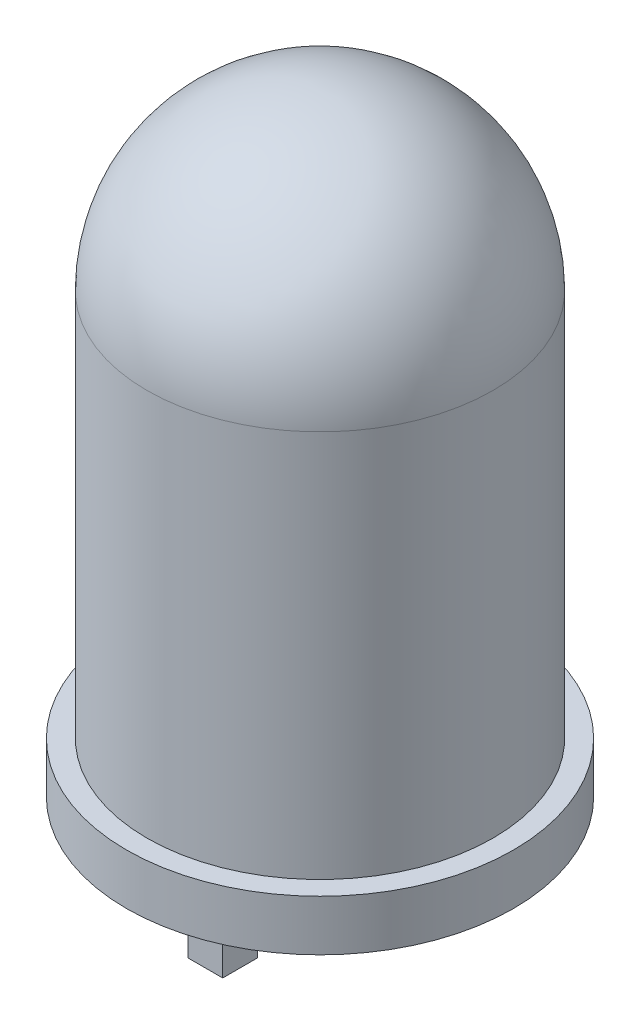
ISO-10303-21;
HEADER;
FILE_DESCRIPTION(('STEP AP214'),'2;1');
FILE_NAME('part.step','',(''),(''),'','','');
FILE_SCHEMA(('AUTOMOTIVE_DESIGN { 1 0 10303 214 1 1 1 1 }'));
ENDSEC;
DATA;
#1=APPLICATION_CONTEXT('core data for automotive mechanical design processes');
#2=APPLICATION_PROTOCOL_DEFINITION('international standard','automotive_design',2000,#1);
#3=PRODUCT_CONTEXT('',#1,'mechanical');
#4=PRODUCT('Part','Part','',(#3));
#5=PRODUCT_RELATED_PRODUCT_CATEGORY('part','',(#4));
#6=PRODUCT_DEFINITION_FORMATION('','',#4);
#7=PRODUCT_DEFINITION_CONTEXT('part definition',#1,'design');
#8=PRODUCT_DEFINITION('design','',#6,#7);
#9=PRODUCT_DEFINITION_SHAPE('','',#8);
#10=(LENGTH_UNIT() NAMED_UNIT(*) SI_UNIT(.MILLI.,.METRE.));
#11=(NAMED_UNIT(*) PLANE_ANGLE_UNIT() SI_UNIT($,.RADIAN.));
#12=(NAMED_UNIT(*) SI_UNIT($,.STERADIAN.) SOLID_ANGLE_UNIT());
#13=UNCERTAINTY_MEASURE_WITH_UNIT(LENGTH_MEASURE(1.E-05),#10,'distance_accuracy_value','');
#14=(GEOMETRIC_REPRESENTATION_CONTEXT(3) GLOBAL_UNCERTAINTY_ASSIGNED_CONTEXT((#13)) GLOBAL_UNIT_ASSIGNED_CONTEXT((#10,
#11,#12)) REPRESENTATION_CONTEXT('',''));
#15=CARTESIAN_POINT('',(0.,0.,0.));
#16=DIRECTION('',(0.,0.,1.));
#17=DIRECTION('',(1.,0.,0.));
#18=AXIS2_PLACEMENT_3D('',#15,#16,#17);
#19=CARTESIAN_POINT('',(2.785,-4.4,0.));
#20=DIRECTION('',(0.,-1.,0.));
#21=DIRECTION('',(0.,0.,-1.));
#22=AXIS2_PLACEMENT_3D('',#19,#20,#21);
#23=PLANE('',#22);
#24=CARTESIAN_POINT('',(0.,-4.4,0.));
#25=DIRECTION('',(0.,-1.,0.));
#26=DIRECTION('',(0.,0.,-1.));
#27=AXIS2_PLACEMENT_3D('',#24,#25,#26);
#28=CIRCLE('',#27,2.785);
#29=CARTESIAN_POINT('',(0.,-4.4,-2.785));
#30=VERTEX_POINT('',#29);
#31=EDGE_CURVE('E175',#30,#30,#28,.T.);
#32=ORIENTED_EDGE('',*,*,#31,.T.);
#33=EDGE_LOOP('',(#32));
#34=FACE_BOUND('',#33,.T.);
#35=DIRECTION('',(-1.,0.,0.));
#36=VECTOR('',#35,1.);
#37=CARTESIAN_POINT('',(0.25,-4.4,-1.15));
#38=LINE('',#37,#36);
#39=CARTESIAN_POINT('',(0.25,-4.4,-1.15));
#40=VERTEX_POINT('',#39);
#41=CARTESIAN_POINT('',(-0.25,-4.4,-1.15));
#42=VERTEX_POINT('',#41);
#43=EDGE_CURVE('E153',#40,#42,#38,.T.);
#44=ORIENTED_EDGE('',*,*,#43,.F.);
#45=DIRECTION('',(0.,0.,1.));
#46=VECTOR('',#45,1.);
#47=CARTESIAN_POINT('',(0.25,-4.4,-1.65));
#48=LINE('',#47,#46);
#49=CARTESIAN_POINT('',(0.25,-4.4,-1.65));
#50=VERTEX_POINT('',#49);
#51=EDGE_CURVE('E134',#50,#40,#48,.T.);
#52=ORIENTED_EDGE('',*,*,#51,.F.);
#53=DIRECTION('',(1.,0.,0.));
#54=VECTOR('',#53,1.);
#55=CARTESIAN_POINT('',(0.25,-4.4,-1.65));
#56=LINE('',#55,#54);
#57=CARTESIAN_POINT('',(-0.25,-4.4,-1.65));
#58=VERTEX_POINT('',#57);
#59=EDGE_CURVE('E140',#58,#50,#56,.T.);
#60=ORIENTED_EDGE('',*,*,#59,.F.);
#61=DIRECTION('',(0.,0.,-1.));
#62=VECTOR('',#61,1.);
#63=CARTESIAN_POINT('',(-0.25,-4.4,-1.65));
#64=LINE('',#63,#62);
#65=EDGE_CURVE('E156',#42,#58,#64,.T.);
#66=ORIENTED_EDGE('',*,*,#65,.F.);
#67=EDGE_LOOP('',(#44,#52,#60,#66));
#68=FACE_BOUND('',#67,.T.);
#69=DIRECTION('',(-1.,0.,0.));
#70=VECTOR('',#69,1.);
#71=CARTESIAN_POINT('',(0.25,-4.4,1.65));
#72=LINE('',#71,#70);
#73=CARTESIAN_POINT('',(0.25,-4.4,1.65));
#74=VERTEX_POINT('',#73);
#75=CARTESIAN_POINT('',(-0.25,-4.4,1.65));
#76=VERTEX_POINT('',#75);
#77=EDGE_CURVE('E337',#74,#76,#72,.T.);
#78=ORIENTED_EDGE('',*,*,#77,.F.);
#79=DIRECTION('',(0.,0.,1.));
#80=VECTOR('',#79,1.);
#81=CARTESIAN_POINT('',(0.25,-4.4,1.15));
#82=LINE('',#81,#80);
#83=CARTESIAN_POINT('',(0.25,-4.4,1.15));
#84=VERTEX_POINT('',#83);
#85=EDGE_CURVE('E113',#84,#74,#82,.T.);
#86=ORIENTED_EDGE('',*,*,#85,.F.);
#87=DIRECTION('',(1.,0.,0.));
#88=VECTOR('',#87,1.);
#89=CARTESIAN_POINT('',(0.25,-4.4,1.15));
#90=LINE('',#89,#88);
#91=CARTESIAN_POINT('',(-0.25,-4.4,1.15));
#92=VERTEX_POINT('',#91);
#93=EDGE_CURVE('E118',#92,#84,#90,.T.);
#94=ORIENTED_EDGE('',*,*,#93,.F.);
#95=DIRECTION('',(0.,0.,-1.));
#96=VECTOR('',#95,1.);
#97=CARTESIAN_POINT('',(-0.25,-4.4,1.15));
#98=LINE('',#97,#96);
#99=EDGE_CURVE('E126',#76,#92,#98,.T.);
#100=ORIENTED_EDGE('',*,*,#99,.F.);
#101=EDGE_LOOP('',(#78,#86,#94,#100));
#102=FACE_BOUND('',#101,.T.);
#103=ADVANCED_FACE('F39',(#34,#68,#102),#23,.T.);
#104=CARTESIAN_POINT('',(0.,1.91,0.));
#105=DIRECTION('',(0.,-1.,0.));
#106=DIRECTION('',(1.,0.,0.));
#107=AXIS2_PLACEMENT_3D('',#104,#105,#106);
#108=SPHERICAL_SURFACE('',#107,2.49);
#109=CARTESIAN_POINT('',(0.,1.91,0.));
#110=DIRECTION('',(0.,-1.,0.));
#111=DIRECTION('',(0.,0.,-1.));
#112=AXIS2_PLACEMENT_3D('',#109,#110,#111);
#113=CIRCLE('',#112,2.49);
#114=CARTESIAN_POINT('',(0.,1.91,-2.49));
#115=VERTEX_POINT('',#114);
#116=EDGE_CURVE('E47',#115,#115,#113,.T.);
#117=ORIENTED_EDGE('',*,*,#116,.F.);
#118=EDGE_LOOP('',(#117));
#119=FACE_BOUND('',#118,.T.);
#120=ADVANCED_FACE('F193',(#119),#108,.T.);
#121=CARTESIAN_POINT('',(0.,-4.4,0.));
#122=DIRECTION('',(0.,-1.,0.));
#123=DIRECTION('',(0.,0.,-1.));
#124=AXIS2_PLACEMENT_3D('',#121,#122,#123);
#125=CYLINDRICAL_SURFACE('',#124,2.49);
#126=ORIENTED_EDGE('',*,*,#116,.T.);
#127=EDGE_LOOP('',(#126));
#128=FACE_BOUND('',#127,.T.);
#129=CARTESIAN_POINT('',(0.,-3.66986899563319,0.));
#130=DIRECTION('',(0.,-1.,0.));
#131=DIRECTION('',(0.,0.,-1.));
#132=AXIS2_PLACEMENT_3D('',#129,#130,#131);
#133=CIRCLE('',#132,2.49);
#134=CARTESIAN_POINT('',(0.,-3.66986899563319,-2.49));
#135=VERTEX_POINT('',#134);
#136=EDGE_CURVE('E183',#135,#135,#133,.T.);
#137=ORIENTED_EDGE('',*,*,#136,.F.);
#138=EDGE_LOOP('',(#137));
#139=FACE_BOUND('',#138,.T.);
#140=ADVANCED_FACE('F190',(#128,#139),#125,.T.);
#141=CARTESIAN_POINT('',(2.49,-3.66986899563319,0.));
#142=DIRECTION('',(0.,1.,0.));
#143=DIRECTION('',(0.,0.,1.));
#144=AXIS2_PLACEMENT_3D('',#141,#142,#143);
#145=PLANE('',#144);
#146=ORIENTED_EDGE('',*,*,#136,.T.);
#147=EDGE_LOOP('',(#146));
#148=FACE_BOUND('',#147,.T.);
#149=CARTESIAN_POINT('',(0.,-3.66986899563319,0.));
#150=DIRECTION('',(0.,-1.,0.));
#151=DIRECTION('',(0.,0.,-1.));
#152=AXIS2_PLACEMENT_3D('',#149,#150,#151);
#153=CIRCLE('',#152,2.785);
#154=CARTESIAN_POINT('',(0.,-3.66986899563319,-2.785));
#155=VERTEX_POINT('',#154);
#156=EDGE_CURVE('E179',#155,#155,#153,.T.);
#157=ORIENTED_EDGE('',*,*,#156,.F.);
#158=EDGE_LOOP('',(#157));
#159=FACE_BOUND('',#158,.T.);
#160=ADVANCED_FACE('F199',(#148,#159),#145,.T.);
#161=CARTESIAN_POINT('',(0.,-4.4,0.));
#162=DIRECTION('',(0.,-1.,0.));
#163=DIRECTION('',(0.,0.,-1.));
#164=AXIS2_PLACEMENT_3D('',#161,#162,#163);
#165=CYLINDRICAL_SURFACE('',#164,2.785);
#166=ORIENTED_EDGE('',*,*,#156,.T.);
#167=EDGE_LOOP('',(#166));
#168=FACE_BOUND('',#167,.T.);
#169=ORIENTED_EDGE('',*,*,#31,.F.);
#170=EDGE_LOOP('',(#169));
#171=FACE_BOUND('',#170,.T.);
#172=ADVANCED_FACE('F205',(#168,#171),#165,.T.);
#173=CARTESIAN_POINT('',(0.25,-6.4,-1.65));
#174=DIRECTION('',(-1.,0.,0.));
#175=DIRECTION('',(0.,0.,1.));
#176=AXIS2_PLACEMENT_3D('',#173,#174,#175);
#177=PLANE('',#176);
#178=ORIENTED_EDGE('',*,*,#51,.T.);
#179=DIRECTION('',(0.,1.,0.));
#180=VECTOR('',#179,1.);
#181=CARTESIAN_POINT('',(0.25,-6.4,-1.15));
#182=LINE('',#181,#180);
#183=CARTESIAN_POINT('',(0.25,-6.4,-1.15));
#184=VERTEX_POINT('',#183);
#185=EDGE_CURVE('E172',#184,#40,#182,.T.);
#186=ORIENTED_EDGE('',*,*,#185,.F.);
#187=DIRECTION('',(0.,0.,1.));
#188=VECTOR('',#187,1.);
#189=CARTESIAN_POINT('',(0.25,-6.4,-1.65));
#190=LINE('',#189,#188);
#191=CARTESIAN_POINT('',(0.25,-6.4,-1.65));
#192=VERTEX_POINT('',#191);
#193=EDGE_CURVE('E135',#192,#184,#190,.T.);
#194=ORIENTED_EDGE('',*,*,#193,.F.);
#195=DIRECTION('',(0.,1.,0.));
#196=VECTOR('',#195,1.);
#197=CARTESIAN_POINT('',(0.25,-6.4,-1.65));
#198=LINE('',#197,#196);
#199=EDGE_CURVE('E149',#192,#50,#198,.T.);
#200=ORIENTED_EDGE('',*,*,#199,.T.);
#201=EDGE_LOOP('',(#178,#186,#194,#200));
#202=FACE_BOUND('',#201,.T.);
#203=ADVANCED_FACE('F209',(#202),#177,.F.);
#204=CARTESIAN_POINT('',(0.25,-6.4,-1.15));
#205=DIRECTION('',(0.,0.,-1.));
#206=DIRECTION('',(-1.,0.,0.));
#207=AXIS2_PLACEMENT_3D('',#204,#205,#206);
#208=PLANE('',#207);
#209=ORIENTED_EDGE('',*,*,#43,.T.);
#210=DIRECTION('',(0.,1.,0.));
#211=VECTOR('',#210,1.);
#212=CARTESIAN_POINT('',(-0.25,-6.4,-1.15));
#213=LINE('',#212,#211);
#214=CARTESIAN_POINT('',(-0.25,-6.4,-1.15));
#215=VERTEX_POINT('',#214);
#216=EDGE_CURVE('E168',#215,#42,#213,.T.);
#217=ORIENTED_EDGE('',*,*,#216,.F.);
#218=DIRECTION('',(-1.,0.,0.));
#219=VECTOR('',#218,1.);
#220=CARTESIAN_POINT('',(0.25,-6.4,-1.15));
#221=LINE('',#220,#219);
#222=EDGE_CURVE('E139',#184,#215,#221,.T.);
#223=ORIENTED_EDGE('',*,*,#222,.F.);
#224=ORIENTED_EDGE('',*,*,#185,.T.);
#225=EDGE_LOOP('',(#209,#217,#223,#224));
#226=FACE_BOUND('',#225,.T.);
#227=ADVANCED_FACE('F213',(#226),#208,.F.);
#228=CARTESIAN_POINT('',(-0.25,-6.4,-1.65));
#229=DIRECTION('',(1.,0.,0.));
#230=DIRECTION('',(0.,0.,-1.));
#231=AXIS2_PLACEMENT_3D('',#228,#229,#230);
#232=PLANE('',#231);
#233=ORIENTED_EDGE('',*,*,#65,.T.);
#234=DIRECTION('',(0.,1.,0.));
#235=VECTOR('',#234,1.);
#236=CARTESIAN_POINT('',(-0.25,-6.4,-1.65));
#237=LINE('',#236,#235);
#238=CARTESIAN_POINT('',(-0.25,-6.4,-1.65));
#239=VERTEX_POINT('',#238);
#240=EDGE_CURVE('E165',#239,#58,#237,.T.);
#241=ORIENTED_EDGE('',*,*,#240,.F.);
#242=DIRECTION('',(0.,0.,-1.));
#243=VECTOR('',#242,1.);
#244=CARTESIAN_POINT('',(-0.25,-6.4,-1.65));
#245=LINE('',#244,#243);
#246=EDGE_CURVE('E143',#215,#239,#245,.T.);
#247=ORIENTED_EDGE('',*,*,#246,.F.);
#248=ORIENTED_EDGE('',*,*,#216,.T.);
#249=EDGE_LOOP('',(#233,#241,#247,#248));
#250=FACE_BOUND('',#249,.T.);
#251=ADVANCED_FACE('F217',(#250),#232,.F.);
#252=CARTESIAN_POINT('',(0.25,-6.4,-1.65));
#253=DIRECTION('',(0.,0.,1.));
#254=DIRECTION('',(1.,0.,0.));
#255=AXIS2_PLACEMENT_3D('',#252,#253,#254);
#256=PLANE('',#255);
#257=ORIENTED_EDGE('',*,*,#59,.T.);
#258=ORIENTED_EDGE('',*,*,#199,.F.);
#259=DIRECTION('',(1.,0.,0.));
#260=VECTOR('',#259,1.);
#261=CARTESIAN_POINT('',(0.25,-6.4,-1.65));
#262=LINE('',#261,#260);
#263=EDGE_CURVE('E146',#239,#192,#262,.T.);
#264=ORIENTED_EDGE('',*,*,#263,.F.);
#265=ORIENTED_EDGE('',*,*,#240,.T.);
#266=EDGE_LOOP('',(#257,#258,#264,#265));
#267=FACE_BOUND('',#266,.T.);
#268=ADVANCED_FACE('F221',(#267),#256,.F.);
#269=CARTESIAN_POINT('',(0.,-6.4,0.));
#270=DIRECTION('',(0.,-1.,0.));
#271=DIRECTION('',(0.,0.,-1.));
#272=AXIS2_PLACEMENT_3D('',#269,#270,#271);
#273=PLANE('',#272);
#274=ORIENTED_EDGE('',*,*,#193,.T.);
#275=ORIENTED_EDGE('',*,*,#222,.T.);
#276=ORIENTED_EDGE('',*,*,#246,.T.);
#277=ORIENTED_EDGE('',*,*,#263,.T.);
#278=EDGE_LOOP('',(#274,#275,#276,#277));
#279=FACE_BOUND('',#278,.T.);
#280=ADVANCED_FACE('F225',(#279),#273,.T.);
#281=CARTESIAN_POINT('',(0.25,-6.4,1.15));
#282=DIRECTION('',(-1.,0.,0.));
#283=DIRECTION('',(0.,0.,1.));
#284=AXIS2_PLACEMENT_3D('',#281,#282,#283);
#285=PLANE('',#284);
#286=DIRECTION('',(0.,1.,0.));
#287=VECTOR('',#286,1.);
#288=CARTESIAN_POINT('',(0.25,-6.4,1.65));
#289=LINE('',#288,#287);
#290=CARTESIAN_POINT('',(0.25,-5.70756782145611,1.65));
#291=VERTEX_POINT('',#290);
#292=EDGE_CURVE('E111',#291,#74,#289,.T.);
#293=ORIENTED_EDGE('',*,*,#292,.F.);
#294=DIRECTION('',(0.,0.,-1.));
#295=VECTOR('',#294,1.);
#296=CARTESIAN_POINT('',(0.25,-5.70756782145611,1.15));
#297=LINE('',#296,#295);
#298=CARTESIAN_POINT('',(0.25,-5.70756782145611,1.15));
#299=VERTEX_POINT('',#298);
#300=EDGE_CURVE('E103',#291,#299,#297,.T.);
#301=ORIENTED_EDGE('',*,*,#300,.T.);
#302=DIRECTION('',(0.,1.,0.));
#303=VECTOR('',#302,1.);
#304=CARTESIAN_POINT('',(0.25,-6.4,1.15));
#305=LINE('',#304,#303);
#306=EDGE_CURVE('E110',#299,#84,#305,.T.);
#307=ORIENTED_EDGE('',*,*,#306,.T.);
#308=ORIENTED_EDGE('',*,*,#85,.T.);
#309=EDGE_LOOP('',(#293,#301,#307,#308));
#310=FACE_BOUND('',#309,.T.);
#311=ADVANCED_FACE('F108',(#310),#285,.F.);
#312=CARTESIAN_POINT('',(0.25,-6.4,1.65));
#313=DIRECTION('',(0.,0.,-1.));
#314=DIRECTION('',(-1.,0.,0.));
#315=AXIS2_PLACEMENT_3D('',#312,#313,#314);
#316=PLANE('',#315);
#317=DIRECTION('',(0.,1.,0.));
#318=VECTOR('',#317,1.);
#319=CARTESIAN_POINT('',(-0.25,-6.4,1.65));
#320=LINE('',#319,#318);
#321=CARTESIAN_POINT('',(-0.25,-5.70756782145611,1.65));
#322=VERTEX_POINT('',#321);
#323=EDGE_CURVE('E124',#322,#76,#320,.T.);
#324=ORIENTED_EDGE('',*,*,#323,.F.);
#325=DIRECTION('',(1.,0.,0.));
#326=VECTOR('',#325,1.);
#327=CARTESIAN_POINT('',(0.25,-5.70756782145611,1.65));
#328=LINE('',#327,#326);
#329=EDGE_CURVE('E114',#322,#291,#328,.T.);
#330=ORIENTED_EDGE('',*,*,#329,.T.);
#331=ORIENTED_EDGE('',*,*,#292,.T.);
#332=ORIENTED_EDGE('',*,*,#77,.T.);
#333=EDGE_LOOP('',(#324,#330,#331,#332));
#334=FACE_BOUND('',#333,.T.);
#335=ADVANCED_FACE('F232',(#334),#316,.F.);
#336=CARTESIAN_POINT('',(-0.25,-6.4,1.15));
#337=DIRECTION('',(1.,0.,0.));
#338=DIRECTION('',(0.,0.,-1.));
#339=AXIS2_PLACEMENT_3D('',#336,#337,#338);
#340=PLANE('',#339);
#341=DIRECTION('',(0.,1.,0.));
#342=VECTOR('',#341,1.);
#343=CARTESIAN_POINT('',(-0.25,-6.4,1.15));
#344=LINE('',#343,#342);
#345=CARTESIAN_POINT('',(-0.25,-5.70756782145611,1.15));
#346=VERTEX_POINT('',#345);
#347=EDGE_CURVE('E60',#346,#92,#344,.T.);
#348=ORIENTED_EDGE('',*,*,#347,.F.);
#349=DIRECTION('',(0.,0.,1.));
#350=VECTOR('',#349,1.);
#351=CARTESIAN_POINT('',(-0.25,-5.70756782145611,1.15));
#352=LINE('',#351,#350);
#353=EDGE_CURVE('E54',#346,#322,#352,.T.);
#354=ORIENTED_EDGE('',*,*,#353,.T.);
#355=ORIENTED_EDGE('',*,*,#323,.T.);
#356=ORIENTED_EDGE('',*,*,#99,.T.);
#357=EDGE_LOOP('',(#348,#354,#355,#356));
#358=FACE_BOUND('',#357,.T.);
#359=ADVANCED_FACE('F235',(#358),#340,.F.);
#360=CARTESIAN_POINT('',(0.25,-6.4,1.15));
#361=DIRECTION('',(0.,0.,1.));
#362=DIRECTION('',(1.,0.,0.));
#363=AXIS2_PLACEMENT_3D('',#360,#361,#362);
#364=PLANE('',#363);
#365=ORIENTED_EDGE('',*,*,#306,.F.);
#366=DIRECTION('',(-1.,0.,0.));
#367=VECTOR('',#366,1.);
#368=CARTESIAN_POINT('',(0.25,-5.70756782145611,1.15));
#369=LINE('',#368,#367);
#370=EDGE_CURVE('E11',#299,#346,#369,.T.);
#371=ORIENTED_EDGE('',*,*,#370,.T.);
#372=ORIENTED_EDGE('',*,*,#347,.T.);
#373=ORIENTED_EDGE('',*,*,#93,.T.);
#374=EDGE_LOOP('',(#365,#371,#372,#373));
#375=FACE_BOUND('',#374,.T.);
#376=ADVANCED_FACE('F116',(#375),#364,.F.);
#377=CARTESIAN_POINT('',(-2.785,-5.70756782145611,-0.211211214483882));
#378=DIRECTION('',(0.,1.,0.));
#379=DIRECTION('',(0.,0.,1.));
#380=AXIS2_PLACEMENT_3D('',#377,#378,#379);
#381=PLANE('',#380);
#382=ORIENTED_EDGE('',*,*,#329,.F.);
#383=ORIENTED_EDGE('',*,*,#353,.F.);
#384=ORIENTED_EDGE('',*,*,#370,.F.);
#385=ORIENTED_EDGE('',*,*,#300,.F.);
#386=EDGE_LOOP('',(#382,#383,#384,#385));
#387=FACE_BOUND('',#386,.T.);
#388=ADVANCED_FACE('F102',(#387),#381,.F.);
#389=CLOSED_SHELL('',(#103,#120,#140,#160,#172,#203,#227,#251,#268,#280,#311,#335,#359,#376,#388));
#390=MANIFOLD_SOLID_BREP('B2',#389);
#391=ADVANCED_BREP_SHAPE_REPRESENTATION('',(#18,#390),#14);
#392=SHAPE_DEFINITION_REPRESENTATION(#9,#391);
ENDSEC;
END-ISO-10303-21;
